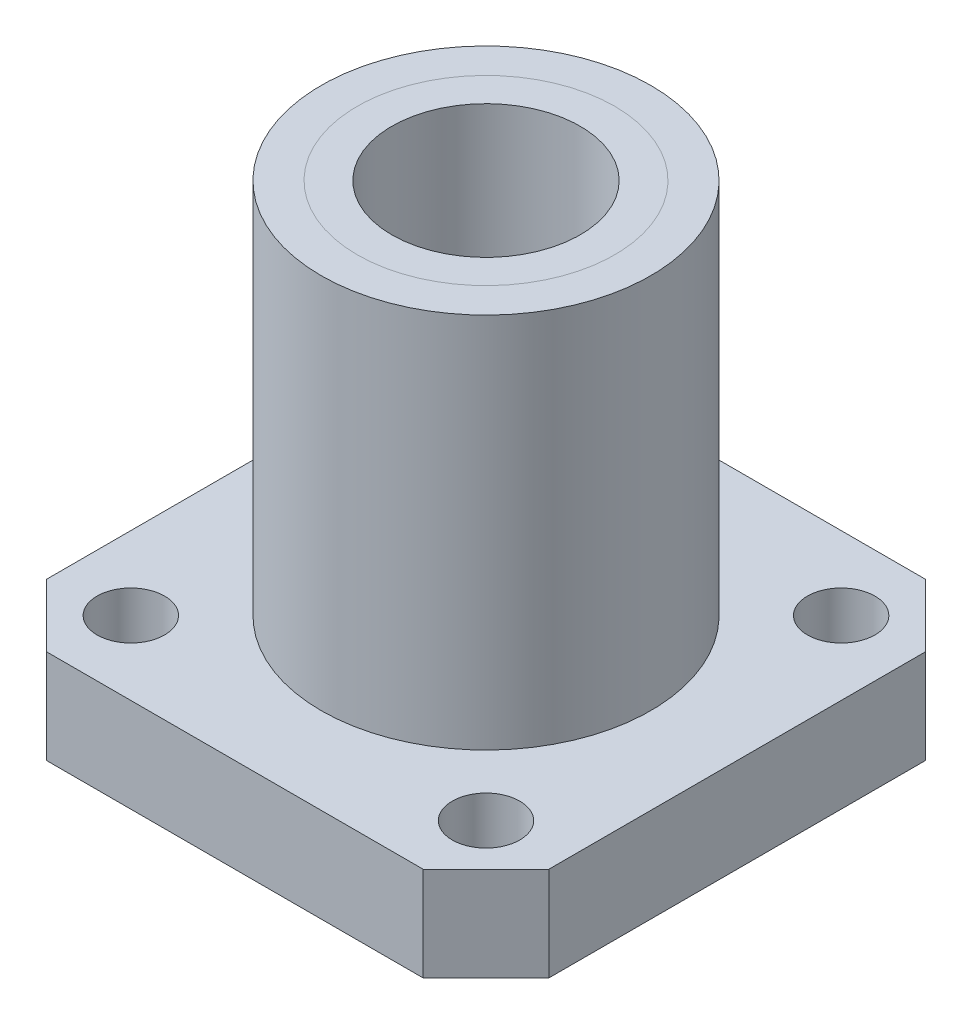
ISO-10303-21;
HEADER;
FILE_DESCRIPTION(('STEP AP214'),'2;1');
FILE_NAME('part.step','',(''),(''),'','','');
FILE_SCHEMA(('AUTOMOTIVE_DESIGN { 1 0 10303 214 1 1 1 1 }'));
ENDSEC;
DATA;
#1=APPLICATION_CONTEXT('core data for automotive mechanical design processes');
#2=APPLICATION_PROTOCOL_DEFINITION('international standard','automotive_design',2000,#1);
#3=PRODUCT_CONTEXT('',#1,'mechanical');
#4=PRODUCT('Part','Part','',(#3));
#5=PRODUCT_RELATED_PRODUCT_CATEGORY('part','',(#4));
#6=PRODUCT_DEFINITION_FORMATION('','',#4);
#7=PRODUCT_DEFINITION_CONTEXT('part definition',#1,'design');
#8=PRODUCT_DEFINITION('design','',#6,#7);
#9=PRODUCT_DEFINITION_SHAPE('','',#8);
#10=(LENGTH_UNIT() NAMED_UNIT(*) SI_UNIT(.MILLI.,.METRE.));
#11=(NAMED_UNIT(*) PLANE_ANGLE_UNIT() SI_UNIT($,.RADIAN.));
#12=(NAMED_UNIT(*) SI_UNIT($,.STERADIAN.) SOLID_ANGLE_UNIT());
#13=UNCERTAINTY_MEASURE_WITH_UNIT(LENGTH_MEASURE(1.E-05),#10,'distance_accuracy_value','');
#14=(GEOMETRIC_REPRESENTATION_CONTEXT(3) GLOBAL_UNCERTAINTY_ASSIGNED_CONTEXT((#13)) GLOBAL_UNIT_ASSIGNED_CONTEXT((#10,
#11,#12)) REPRESENTATION_CONTEXT('',''));
#15=CARTESIAN_POINT('',(0.,0.,0.));
#16=DIRECTION('',(0.,0.,1.));
#17=DIRECTION('',(1.,0.,0.));
#18=AXIS2_PLACEMENT_3D('',#15,#16,#17);
#19=CARTESIAN_POINT('',(0.,0.,0.));
#20=DIRECTION('',(0.,1.,0.));
#21=DIRECTION('',(0.,0.,1.));
#22=AXIS2_PLACEMENT_3D('',#19,#20,#21);
#23=PLANE('',#22);
#24=DIRECTION('',(-1.,0.,0.));
#25=VECTOR('',#24,1.);
#26=CARTESIAN_POINT('',(-16.,0.,-16.));
#27=LINE('',#26,#25);
#28=CARTESIAN_POINT('',(12.,0.,-16.));
#29=VERTEX_POINT('',#28);
#30=CARTESIAN_POINT('',(-12.,0.,-16.));
#31=VERTEX_POINT('',#30);
#32=EDGE_CURVE('E120',#29,#31,#27,.T.);
#33=ORIENTED_EDGE('',*,*,#32,.F.);
#34=DIRECTION('',(-0.707106781186546,0.,-0.707106781186549));
#35=VECTOR('',#34,1.);
#36=CARTESIAN_POINT('',(12.,0.,-16.));
#37=LINE('',#36,#35);
#38=CARTESIAN_POINT('',(16.,0.,-12.));
#39=VERTEX_POINT('',#38);
#40=EDGE_CURVE('E103',#29,#39,#37,.F.);
#41=ORIENTED_EDGE('',*,*,#40,.T.);
#42=DIRECTION('',(0.,0.,-1.));
#43=VECTOR('',#42,1.);
#44=CARTESIAN_POINT('',(16.,0.,-16.));
#45=LINE('',#44,#43);
#46=CARTESIAN_POINT('',(16.,0.,12.));
#47=VERTEX_POINT('',#46);
#48=EDGE_CURVE('E130',#47,#39,#45,.T.);
#49=ORIENTED_EDGE('',*,*,#48,.F.);
#50=DIRECTION('',(0.707106781186549,0.,-0.707106781186546));
#51=VECTOR('',#50,1.);
#52=CARTESIAN_POINT('',(16.,0.,12.));
#53=LINE('',#52,#51);
#54=CARTESIAN_POINT('',(12.,0.,16.));
#55=VERTEX_POINT('',#54);
#56=EDGE_CURVE('E114',#47,#55,#53,.F.);
#57=ORIENTED_EDGE('',*,*,#56,.T.);
#58=DIRECTION('',(1.,0.,0.));
#59=VECTOR('',#58,1.);
#60=CARTESIAN_POINT('',(-16.,0.,16.));
#61=LINE('',#60,#59);
#62=CARTESIAN_POINT('',(-12.,0.,16.));
#63=VERTEX_POINT('',#62);
#64=EDGE_CURVE('E133',#63,#55,#61,.T.);
#65=ORIENTED_EDGE('',*,*,#64,.F.);
#66=DIRECTION('',(0.707106781186546,0.,0.707106781186549));
#67=VECTOR('',#66,1.);
#68=CARTESIAN_POINT('',(-12.,0.,16.));
#69=LINE('',#68,#67);
#70=CARTESIAN_POINT('',(-16.,0.,12.));
#71=VERTEX_POINT('',#70);
#72=EDGE_CURVE('E171',#63,#71,#69,.F.);
#73=ORIENTED_EDGE('',*,*,#72,.T.);
#74=DIRECTION('',(0.,0.,1.));
#75=VECTOR('',#74,1.);
#76=CARTESIAN_POINT('',(-16.,0.,-16.));
#77=LINE('',#76,#75);
#78=CARTESIAN_POINT('',(-16.,0.,-12.));
#79=VERTEX_POINT('',#78);
#80=EDGE_CURVE('E129',#79,#71,#77,.T.);
#81=ORIENTED_EDGE('',*,*,#80,.F.);
#82=DIRECTION('',(-0.707106781186549,0.,0.707106781186546));
#83=VECTOR('',#82,1.);
#84=CARTESIAN_POINT('',(-16.,0.,-12.));
#85=LINE('',#84,#83);
#86=EDGE_CURVE('E124',#79,#31,#85,.F.);
#87=ORIENTED_EDGE('',*,*,#86,.T.);
#88=EDGE_LOOP('',(#33,#41,#49,#57,#65,#73,#81,#87));
#89=FACE_BOUND('',#88,.T.);
#90=CARTESIAN_POINT('',(-11.3137084989848,0.,-11.3137084989848));
#91=DIRECTION('',(0.,1.,0.));
#92=DIRECTION('',(0.,0.,1.));
#93=AXIS2_PLACEMENT_3D('',#90,#91,#92);
#94=CIRCLE('',#93,2.15);
#95=CARTESIAN_POINT('',(-11.3137084989848,0.,-9.16370849898476));
#96=VERTEX_POINT('',#95);
#97=EDGE_CURVE('E156',#96,#96,#94,.T.);
#98=ORIENTED_EDGE('',*,*,#97,.T.);
#99=EDGE_LOOP('',(#98));
#100=FACE_BOUND('',#99,.T.);
#101=CARTESIAN_POINT('',(-11.3137084989848,0.,11.3137084989848));
#102=DIRECTION('',(0.,1.,0.));
#103=DIRECTION('',(0.,0.,1.));
#104=AXIS2_PLACEMENT_3D('',#101,#102,#103);
#105=CIRCLE('',#104,2.15);
#106=CARTESIAN_POINT('',(-11.3137084989848,0.,13.4637084989848));
#107=VERTEX_POINT('',#106);
#108=EDGE_CURVE('E160',#107,#107,#105,.T.);
#109=ORIENTED_EDGE('',*,*,#108,.T.);
#110=EDGE_LOOP('',(#109));
#111=FACE_BOUND('',#110,.T.);
#112=CARTESIAN_POINT('',(11.3137084989847,0.,11.3137084989848));
#113=DIRECTION('',(0.,1.,0.));
#114=DIRECTION('',(0.,0.,1.));
#115=AXIS2_PLACEMENT_3D('',#112,#113,#114);
#116=CIRCLE('',#115,2.15);
#117=CARTESIAN_POINT('',(11.3137084989847,0.,13.4637084989848));
#118=VERTEX_POINT('',#117);
#119=EDGE_CURVE('E164',#118,#118,#116,.T.);
#120=ORIENTED_EDGE('',*,*,#119,.T.);
#121=EDGE_LOOP('',(#120));
#122=FACE_BOUND('',#121,.T.);
#123=CARTESIAN_POINT('',(11.3137084989847,0.,-11.3137084989848));
#124=DIRECTION('',(0.,1.,0.));
#125=DIRECTION('',(0.,0.,1.));
#126=AXIS2_PLACEMENT_3D('',#123,#124,#125);
#127=CIRCLE('',#126,2.15);
#128=CARTESIAN_POINT('',(11.3137084989847,0.,-9.16370849898476));
#129=VERTEX_POINT('',#128);
#130=EDGE_CURVE('E168',#129,#129,#127,.T.);
#131=ORIENTED_EDGE('',*,*,#130,.T.);
#132=EDGE_LOOP('',(#131));
#133=FACE_BOUND('',#132,.T.);
#134=CARTESIAN_POINT('',(0.,0.,0.));
#135=DIRECTION('',(0.,1.,0.));
#136=DIRECTION('',(0.,0.,1.));
#137=AXIS2_PLACEMENT_3D('',#134,#135,#136);
#138=CIRCLE('',#137,8.2);
#139=CARTESIAN_POINT('',(0.,0.,8.2));
#140=VERTEX_POINT('',#139);
#141=EDGE_CURVE('E11',#140,#140,#138,.F.);
#142=ORIENTED_EDGE('',*,*,#141,.F.);
#143=EDGE_LOOP('',(#142));
#144=FACE_BOUND('',#143,.T.);
#145=ADVANCED_FACE('F35',(#89,#100,#111,#122,#133,#144),#23,.F.);
#146=CARTESIAN_POINT('',(0.,30.,0.));
#147=DIRECTION('',(0.,1.,0.));
#148=DIRECTION('',(0.,0.,1.));
#149=AXIS2_PLACEMENT_3D('',#146,#147,#148);
#150=PLANE('',#149);
#151=CARTESIAN_POINT('',(0.,30.,0.));
#152=DIRECTION('',(0.,1.,0.));
#153=DIRECTION('',(0.,0.,1.));
#154=AXIS2_PLACEMENT_3D('',#151,#152,#153);
#155=CIRCLE('',#154,10.5);
#156=CARTESIAN_POINT('',(0.,30.,10.5));
#157=VERTEX_POINT('',#156);
#158=EDGE_CURVE('E149',#157,#157,#155,.T.);
#159=ORIENTED_EDGE('',*,*,#158,.T.);
#160=EDGE_LOOP('',(#159));
#161=FACE_BOUND('',#160,.T.);
#162=CARTESIAN_POINT('',(0.,30.,0.));
#163=DIRECTION('',(0.,1.,0.));
#164=DIRECTION('',(0.,0.,1.));
#165=AXIS2_PLACEMENT_3D('',#162,#163,#164);
#166=CIRCLE('',#165,8.2);
#167=CARTESIAN_POINT('',(0.,30.,8.2));
#168=VERTEX_POINT('',#167);
#169=EDGE_CURVE('E39',#168,#168,#166,.F.);
#170=ORIENTED_EDGE('',*,*,#169,.T.);
#171=EDGE_LOOP('',(#170));
#172=FACE_BOUND('',#171,.T.);
#173=ADVANCED_FACE('F201',(#161,#172),#150,.T.);
#174=ORIENTED_EDGE('',*,*,#169,.F.);
#175=EDGE_LOOP('',(#174));
#176=FACE_BOUND('',#175,.T.);
#177=CARTESIAN_POINT('',(0.,30.,0.));
#178=DIRECTION('',(0.,1.,0.));
#179=DIRECTION('',(0.,0.,1.));
#180=AXIS2_PLACEMENT_3D('',#177,#178,#179);
#181=CIRCLE('',#180,6.);
#182=CARTESIAN_POINT('',(0.,30.,6.));
#183=VERTEX_POINT('',#182);
#184=EDGE_CURVE('E146',#183,#183,#181,.T.);
#185=ORIENTED_EDGE('',*,*,#184,.F.);
#186=EDGE_LOOP('',(#185));
#187=FACE_BOUND('',#186,.T.);
#188=ADVANCED_FACE('F203',(#176,#187),#150,.T.);
#189=ORIENTED_EDGE('',*,*,#141,.T.);
#190=EDGE_LOOP('',(#189));
#191=FACE_BOUND('',#190,.T.);
#192=CARTESIAN_POINT('',(0.,0.,0.));
#193=DIRECTION('',(0.,1.,0.));
#194=DIRECTION('',(0.,0.,1.));
#195=AXIS2_PLACEMENT_3D('',#192,#193,#194);
#196=CIRCLE('',#195,6.);
#197=CARTESIAN_POINT('',(0.,0.,6.));
#198=VERTEX_POINT('',#197);
#199=EDGE_CURVE('E144',#198,#198,#196,.T.);
#200=ORIENTED_EDGE('',*,*,#199,.T.);
#201=EDGE_LOOP('',(#200));
#202=FACE_BOUND('',#201,.T.);
#203=ADVANCED_FACE('F206',(#191,#202),#23,.F.);
#204=CARTESIAN_POINT('',(0.,30.,0.));
#205=DIRECTION('',(0.,-1.,0.));
#206=DIRECTION('',(0.,0.,-1.));
#207=AXIS2_PLACEMENT_3D('',#204,#205,#206);
#208=CYLINDRICAL_SURFACE('',#207,10.5);
#209=CARTESIAN_POINT('',(0.,6.,0.));
#210=DIRECTION('',(0.,1.,0.));
#211=DIRECTION('',(0.,0.,1.));
#212=AXIS2_PLACEMENT_3D('',#209,#210,#211);
#213=CIRCLE('',#212,10.5);
#214=CARTESIAN_POINT('',(0.,6.,10.5));
#215=VERTEX_POINT('',#214);
#216=EDGE_CURVE('E141',#215,#215,#213,.T.);
#217=ORIENTED_EDGE('',*,*,#216,.T.);
#218=EDGE_LOOP('',(#217));
#219=FACE_BOUND('',#218,.T.);
#220=ORIENTED_EDGE('',*,*,#158,.F.);
#221=EDGE_LOOP('',(#220));
#222=FACE_BOUND('',#221,.T.);
#223=ADVANCED_FACE('F214',(#219,#222),#208,.T.);
#224=CARTESIAN_POINT('',(0.,30.,0.));
#225=DIRECTION('',(0.,-1.,0.));
#226=DIRECTION('',(0.,0.,-1.));
#227=AXIS2_PLACEMENT_3D('',#224,#225,#226);
#228=CYLINDRICAL_SURFACE('',#227,6.);
#229=ORIENTED_EDGE('',*,*,#184,.T.);
#230=EDGE_LOOP('',(#229));
#231=FACE_BOUND('',#230,.T.);
#232=ORIENTED_EDGE('',*,*,#199,.F.);
#233=EDGE_LOOP('',(#232));
#234=FACE_BOUND('',#233,.T.);
#235=ADVANCED_FACE('F210',(#231,#234),#228,.F.);
#236=CARTESIAN_POINT('',(0.,6.,0.));
#237=DIRECTION('',(0.,1.,0.));
#238=DIRECTION('',(0.,0.,1.));
#239=AXIS2_PLACEMENT_3D('',#236,#237,#238);
#240=PLANE('',#239);
#241=CARTESIAN_POINT('',(11.3137084989847,6.,-11.3137084989848));
#242=DIRECTION('',(0.,1.,0.));
#243=DIRECTION('',(0.,0.,1.));
#244=AXIS2_PLACEMENT_3D('',#241,#242,#243);
#245=CIRCLE('',#244,2.15);
#246=CARTESIAN_POINT('',(11.3137084989847,6.,-9.16370849898476));
#247=VERTEX_POINT('',#246);
#248=EDGE_CURVE('E165',#247,#247,#245,.F.);
#249=ORIENTED_EDGE('',*,*,#248,.T.);
#250=EDGE_LOOP('',(#249));
#251=FACE_BOUND('',#250,.T.);
#252=CARTESIAN_POINT('',(11.3137084989847,6.,11.3137084989848));
#253=DIRECTION('',(0.,1.,0.));
#254=DIRECTION('',(0.,0.,1.));
#255=AXIS2_PLACEMENT_3D('',#252,#253,#254);
#256=CIRCLE('',#255,2.15);
#257=CARTESIAN_POINT('',(11.3137084989847,6.,13.4637084989848));
#258=VERTEX_POINT('',#257);
#259=EDGE_CURVE('E161',#258,#258,#256,.F.);
#260=ORIENTED_EDGE('',*,*,#259,.T.);
#261=EDGE_LOOP('',(#260));
#262=FACE_BOUND('',#261,.T.);
#263=CARTESIAN_POINT('',(-11.3137084989848,6.,11.3137084989848));
#264=DIRECTION('',(0.,1.,0.));
#265=DIRECTION('',(0.,0.,1.));
#266=AXIS2_PLACEMENT_3D('',#263,#264,#265);
#267=CIRCLE('',#266,2.15);
#268=CARTESIAN_POINT('',(-11.3137084989848,6.,13.4637084989848));
#269=VERTEX_POINT('',#268);
#270=EDGE_CURVE('E157',#269,#269,#267,.F.);
#271=ORIENTED_EDGE('',*,*,#270,.T.);
#272=EDGE_LOOP('',(#271));
#273=FACE_BOUND('',#272,.T.);
#274=CARTESIAN_POINT('',(-11.3137084989848,6.,-11.3137084989848));
#275=DIRECTION('',(0.,1.,0.));
#276=DIRECTION('',(0.,0.,1.));
#277=AXIS2_PLACEMENT_3D('',#274,#275,#276);
#278=CIRCLE('',#277,2.15);
#279=CARTESIAN_POINT('',(-11.3137084989848,6.,-9.16370849898476));
#280=VERTEX_POINT('',#279);
#281=EDGE_CURVE('E135',#280,#280,#278,.F.);
#282=ORIENTED_EDGE('',*,*,#281,.T.);
#283=EDGE_LOOP('',(#282));
#284=FACE_BOUND('',#283,.T.);
#285=DIRECTION('',(0.,0.,-1.));
#286=VECTOR('',#285,1.);
#287=CARTESIAN_POINT('',(16.,6.,-16.));
#288=LINE('',#287,#286);
#289=CARTESIAN_POINT('',(16.,6.,12.));
#290=VERTEX_POINT('',#289);
#291=CARTESIAN_POINT('',(16.,6.,-12.));
#292=VERTEX_POINT('',#291);
#293=EDGE_CURVE('E140',#290,#292,#288,.T.);
#294=ORIENTED_EDGE('',*,*,#293,.T.);
#295=DIRECTION('',(0.707106781186546,0.,0.707106781186549));
#296=VECTOR('',#295,1.);
#297=CARTESIAN_POINT('',(14.,6.,-14.));
#298=LINE('',#297,#296);
#299=CARTESIAN_POINT('',(12.,6.,-16.));
#300=VERTEX_POINT('',#299);
#301=EDGE_CURVE('E182',#292,#300,#298,.F.);
#302=ORIENTED_EDGE('',*,*,#301,.T.);
#303=DIRECTION('',(-1.,0.,0.));
#304=VECTOR('',#303,1.);
#305=CARTESIAN_POINT('',(-16.,6.,-16.));
#306=LINE('',#305,#304);
#307=CARTESIAN_POINT('',(-12.,6.,-16.));
#308=VERTEX_POINT('',#307);
#309=EDGE_CURVE('E123',#300,#308,#306,.T.);
#310=ORIENTED_EDGE('',*,*,#309,.T.);
#311=DIRECTION('',(0.707106781186549,0.,-0.707106781186546));
#312=VECTOR('',#311,1.);
#313=CARTESIAN_POINT('',(-14.,6.,-14.));
#314=LINE('',#313,#312);
#315=CARTESIAN_POINT('',(-16.,6.,-12.));
#316=VERTEX_POINT('',#315);
#317=EDGE_CURVE('E177',#308,#316,#314,.F.);
#318=ORIENTED_EDGE('',*,*,#317,.T.);
#319=DIRECTION('',(0.,0.,1.));
#320=VECTOR('',#319,1.);
#321=CARTESIAN_POINT('',(-16.,6.,-16.));
#322=LINE('',#321,#320);
#323=CARTESIAN_POINT('',(-16.,6.,12.));
#324=VERTEX_POINT('',#323);
#325=EDGE_CURVE('E285',#316,#324,#322,.T.);
#326=ORIENTED_EDGE('',*,*,#325,.T.);
#327=DIRECTION('',(-0.707106781186546,0.,-0.707106781186549));
#328=VECTOR('',#327,1.);
#329=CARTESIAN_POINT('',(-14.,6.,14.));
#330=LINE('',#329,#328);
#331=CARTESIAN_POINT('',(-12.,6.,16.));
#332=VERTEX_POINT('',#331);
#333=EDGE_CURVE('E58',#324,#332,#330,.F.);
#334=ORIENTED_EDGE('',*,*,#333,.T.);
#335=DIRECTION('',(1.,0.,0.));
#336=VECTOR('',#335,1.);
#337=CARTESIAN_POINT('',(-16.,6.,16.));
#338=LINE('',#337,#336);
#339=CARTESIAN_POINT('',(12.,6.,16.));
#340=VERTEX_POINT('',#339);
#341=EDGE_CURVE('E145',#332,#340,#338,.T.);
#342=ORIENTED_EDGE('',*,*,#341,.T.);
#343=DIRECTION('',(-0.707106781186549,0.,0.707106781186546));
#344=VECTOR('',#343,1.);
#345=CARTESIAN_POINT('',(14.,6.,14.));
#346=LINE('',#345,#344);
#347=EDGE_CURVE('E180',#340,#290,#346,.F.);
#348=ORIENTED_EDGE('',*,*,#347,.T.);
#349=EDGE_LOOP('',(#294,#302,#310,#318,#326,#334,#342,#348));
#350=FACE_BOUND('',#349,.T.);
#351=ORIENTED_EDGE('',*,*,#216,.F.);
#352=EDGE_LOOP('',(#351));
#353=FACE_BOUND('',#352,.T.);
#354=ADVANCED_FACE('F213',(#251,#262,#273,#284,#350,#353),#240,.T.);
#355=CARTESIAN_POINT('',(16.,6.,-16.));
#356=DIRECTION('',(-1.,0.,0.));
#357=DIRECTION('',(0.,0.,1.));
#358=AXIS2_PLACEMENT_3D('',#355,#356,#357);
#359=PLANE('',#358);
#360=ORIENTED_EDGE('',*,*,#48,.T.);
#361=DIRECTION('',(0.,1.,0.));
#362=VECTOR('',#361,1.);
#363=CARTESIAN_POINT('',(16.,6.,-12.));
#364=LINE('',#363,#362);
#365=EDGE_CURVE('E108',#39,#292,#364,.T.);
#366=ORIENTED_EDGE('',*,*,#365,.T.);
#367=ORIENTED_EDGE('',*,*,#293,.F.);
#368=DIRECTION('',(0.,-1.,0.));
#369=VECTOR('',#368,1.);
#370=CARTESIAN_POINT('',(16.,6.,12.));
#371=LINE('',#370,#369);
#372=EDGE_CURVE('E113',#290,#47,#371,.T.);
#373=ORIENTED_EDGE('',*,*,#372,.T.);
#374=EDGE_LOOP('',(#360,#366,#367,#373));
#375=FACE_BOUND('',#374,.T.);
#376=ADVANCED_FACE('F234',(#375),#359,.F.);
#377=CARTESIAN_POINT('',(-16.,6.,-16.));
#378=DIRECTION('',(0.,0.,1.));
#379=DIRECTION('',(1.,0.,0.));
#380=AXIS2_PLACEMENT_3D('',#377,#378,#379);
#381=PLANE('',#380);
#382=ORIENTED_EDGE('',*,*,#309,.F.);
#383=DIRECTION('',(0.,-1.,0.));
#384=VECTOR('',#383,1.);
#385=CARTESIAN_POINT('',(12.,6.,-16.));
#386=LINE('',#385,#384);
#387=EDGE_CURVE('E107',#300,#29,#386,.T.);
#388=ORIENTED_EDGE('',*,*,#387,.T.);
#389=ORIENTED_EDGE('',*,*,#32,.T.);
#390=DIRECTION('',(0.,1.,0.));
#391=VECTOR('',#390,1.);
#392=CARTESIAN_POINT('',(-12.,6.,-16.));
#393=LINE('',#392,#391);
#394=EDGE_CURVE('E125',#31,#308,#393,.T.);
#395=ORIENTED_EDGE('',*,*,#394,.T.);
#396=EDGE_LOOP('',(#382,#388,#389,#395));
#397=FACE_BOUND('',#396,.T.);
#398=ADVANCED_FACE('F119',(#397),#381,.F.);
#399=CARTESIAN_POINT('',(-16.,6.,-16.));
#400=DIRECTION('',(1.,0.,0.));
#401=DIRECTION('',(0.,0.,-1.));
#402=AXIS2_PLACEMENT_3D('',#399,#400,#401);
#403=PLANE('',#402);
#404=ORIENTED_EDGE('',*,*,#80,.T.);
#405=DIRECTION('',(0.,1.,0.));
#406=VECTOR('',#405,1.);
#407=CARTESIAN_POINT('',(-16.,6.,12.));
#408=LINE('',#407,#406);
#409=EDGE_CURVE('E191',#71,#324,#408,.T.);
#410=ORIENTED_EDGE('',*,*,#409,.T.);
#411=ORIENTED_EDGE('',*,*,#325,.F.);
#412=DIRECTION('',(0.,-1.,0.));
#413=VECTOR('',#412,1.);
#414=CARTESIAN_POINT('',(-16.,6.,-12.));
#415=LINE('',#414,#413);
#416=EDGE_CURVE('E188',#316,#79,#415,.T.);
#417=ORIENTED_EDGE('',*,*,#416,.T.);
#418=EDGE_LOOP('',(#404,#410,#411,#417));
#419=FACE_BOUND('',#418,.T.);
#420=ADVANCED_FACE('F240',(#419),#403,.F.);
#421=CARTESIAN_POINT('',(-16.,6.,16.));
#422=DIRECTION('',(0.,0.,-1.));
#423=DIRECTION('',(-1.,0.,0.));
#424=AXIS2_PLACEMENT_3D('',#421,#422,#423);
#425=PLANE('',#424);
#426=ORIENTED_EDGE('',*,*,#64,.T.);
#427=DIRECTION('',(0.,1.,0.));
#428=VECTOR('',#427,1.);
#429=CARTESIAN_POINT('',(12.,6.,16.));
#430=LINE('',#429,#428);
#431=EDGE_CURVE('E51',#55,#340,#430,.T.);
#432=ORIENTED_EDGE('',*,*,#431,.T.);
#433=ORIENTED_EDGE('',*,*,#341,.F.);
#434=DIRECTION('',(0.,-1.,0.));
#435=VECTOR('',#434,1.);
#436=CARTESIAN_POINT('',(-12.,6.,16.));
#437=LINE('',#436,#435);
#438=EDGE_CURVE('E184',#332,#63,#437,.T.);
#439=ORIENTED_EDGE('',*,*,#438,.T.);
#440=EDGE_LOOP('',(#426,#432,#433,#439));
#441=FACE_BOUND('',#440,.T.);
#442=ADVANCED_FACE('F243',(#441),#425,.F.);
#443=CARTESIAN_POINT('',(-11.3137084989848,30.,-11.3137084989848));
#444=DIRECTION('',(0.,-1.,0.));
#445=DIRECTION('',(0.,0.,-1.));
#446=AXIS2_PLACEMENT_3D('',#443,#444,#445);
#447=CYLINDRICAL_SURFACE('',#446,2.15);
#448=ORIENTED_EDGE('',*,*,#281,.F.);
#449=EDGE_LOOP('',(#448));
#450=FACE_BOUND('',#449,.T.);
#451=ORIENTED_EDGE('',*,*,#97,.F.);
#452=EDGE_LOOP('',(#451));
#453=FACE_BOUND('',#452,.T.);
#454=ADVANCED_FACE('F246',(#450,#453),#447,.F.);
#455=CARTESIAN_POINT('',(-11.3137084989848,30.,11.3137084989848));
#456=DIRECTION('',(0.,-1.,0.));
#457=DIRECTION('',(0.,0.,-1.));
#458=AXIS2_PLACEMENT_3D('',#455,#456,#457);
#459=CYLINDRICAL_SURFACE('',#458,2.15);
#460=ORIENTED_EDGE('',*,*,#270,.F.);
#461=EDGE_LOOP('',(#460));
#462=FACE_BOUND('',#461,.T.);
#463=ORIENTED_EDGE('',*,*,#108,.F.);
#464=EDGE_LOOP('',(#463));
#465=FACE_BOUND('',#464,.T.);
#466=ADVANCED_FACE('F252',(#462,#465),#459,.F.);
#467=CARTESIAN_POINT('',(11.3137084989847,30.,11.3137084989848));
#468=DIRECTION('',(0.,-1.,0.));
#469=DIRECTION('',(0.,0.,-1.));
#470=AXIS2_PLACEMENT_3D('',#467,#468,#469);
#471=CYLINDRICAL_SURFACE('',#470,2.15);
#472=ORIENTED_EDGE('',*,*,#259,.F.);
#473=EDGE_LOOP('',(#472));
#474=FACE_BOUND('',#473,.T.);
#475=ORIENTED_EDGE('',*,*,#119,.F.);
#476=EDGE_LOOP('',(#475));
#477=FACE_BOUND('',#476,.T.);
#478=ADVANCED_FACE('F256',(#474,#477),#471,.F.);
#479=CARTESIAN_POINT('',(11.3137084989847,30.,-11.3137084989848));
#480=DIRECTION('',(0.,-1.,0.));
#481=DIRECTION('',(0.,0.,-1.));
#482=AXIS2_PLACEMENT_3D('',#479,#480,#481);
#483=CYLINDRICAL_SURFACE('',#482,2.15);
#484=ORIENTED_EDGE('',*,*,#248,.F.);
#485=EDGE_LOOP('',(#484));
#486=FACE_BOUND('',#485,.T.);
#487=ORIENTED_EDGE('',*,*,#130,.F.);
#488=EDGE_LOOP('',(#487));
#489=FACE_BOUND('',#488,.T.);
#490=ADVANCED_FACE('F260',(#486,#489),#483,.F.);
#491=CARTESIAN_POINT('',(12.,6.,-16.));
#492=DIRECTION('',(-0.707106781186549,0.,0.707106781186546));
#493=DIRECTION('',(0.,-1.,0.));
#494=AXIS2_PLACEMENT_3D('',#491,#492,#493);
#495=PLANE('',#494);
#496=ORIENTED_EDGE('',*,*,#301,.F.);
#497=ORIENTED_EDGE('',*,*,#365,.F.);
#498=ORIENTED_EDGE('',*,*,#40,.F.);
#499=ORIENTED_EDGE('',*,*,#387,.F.);
#500=EDGE_LOOP('',(#496,#497,#498,#499));
#501=FACE_BOUND('',#500,.T.);
#502=ADVANCED_FACE('F106',(#501),#495,.F.);
#503=CARTESIAN_POINT('',(16.,6.,12.));
#504=DIRECTION('',(-0.707106781186546,0.,-0.707106781186549));
#505=DIRECTION('',(0.,-1.,0.));
#506=AXIS2_PLACEMENT_3D('',#503,#504,#505);
#507=PLANE('',#506);
#508=ORIENTED_EDGE('',*,*,#347,.F.);
#509=ORIENTED_EDGE('',*,*,#431,.F.);
#510=ORIENTED_EDGE('',*,*,#56,.F.);
#511=ORIENTED_EDGE('',*,*,#372,.F.);
#512=EDGE_LOOP('',(#508,#509,#510,#511));
#513=FACE_BOUND('',#512,.T.);
#514=ADVANCED_FACE('F267',(#513),#507,.F.);
#515=CARTESIAN_POINT('',(-12.,6.,16.));
#516=DIRECTION('',(0.707106781186549,0.,-0.707106781186546));
#517=DIRECTION('',(0.,-1.,0.));
#518=AXIS2_PLACEMENT_3D('',#515,#516,#517);
#519=PLANE('',#518);
#520=ORIENTED_EDGE('',*,*,#333,.F.);
#521=ORIENTED_EDGE('',*,*,#409,.F.);
#522=ORIENTED_EDGE('',*,*,#72,.F.);
#523=ORIENTED_EDGE('',*,*,#438,.F.);
#524=EDGE_LOOP('',(#520,#521,#522,#523));
#525=FACE_BOUND('',#524,.T.);
#526=ADVANCED_FACE('F294',(#525),#519,.F.);
#527=CARTESIAN_POINT('',(-16.,6.,-12.));
#528=DIRECTION('',(0.707106781186546,0.,0.707106781186548));
#529=DIRECTION('',(0.,-1.,0.));
#530=AXIS2_PLACEMENT_3D('',#527,#528,#529);
#531=PLANE('',#530);
#532=ORIENTED_EDGE('',*,*,#317,.F.);
#533=ORIENTED_EDGE('',*,*,#394,.F.);
#534=ORIENTED_EDGE('',*,*,#86,.F.);
#535=ORIENTED_EDGE('',*,*,#416,.F.);
#536=EDGE_LOOP('',(#532,#533,#534,#535));
#537=FACE_BOUND('',#536,.T.);
#538=ADVANCED_FACE('F37',(#537),#531,.F.);
#539=CLOSED_SHELL('',(#145,#173,#188,#203,#223,#235,#354,#376,#398,#420,#442,#454,#466,#478,
#490,#502,#514,#526,#538));
#540=MANIFOLD_SOLID_BREP('B2',#539);
#541=ADVANCED_BREP_SHAPE_REPRESENTATION('',(#18,#540),#14);
#542=SHAPE_DEFINITION_REPRESENTATION(#9,#541);
ENDSEC;
END-ISO-10303-21;
